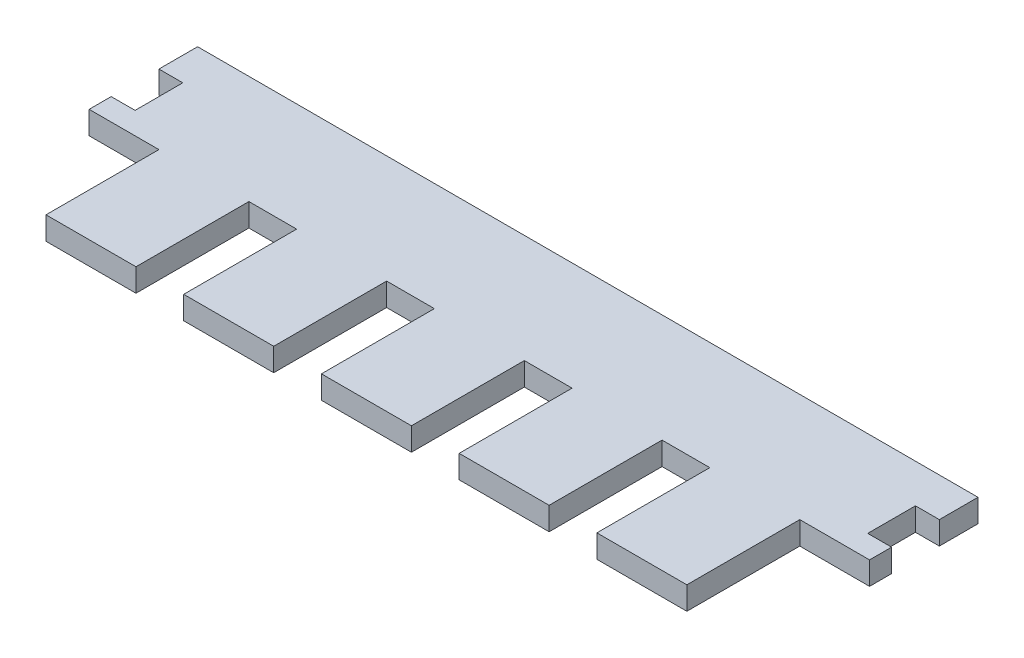
ISO-10303-21;
HEADER;
FILE_DESCRIPTION(('STEP AP214'),'2;1');
FILE_NAME('part.step','',(''),(''),'','','');
FILE_SCHEMA(('AUTOMOTIVE_DESIGN { 1 0 10303 214 1 1 1 1 }'));
ENDSEC;
DATA;
#1=APPLICATION_CONTEXT('core data for automotive mechanical design processes');
#2=APPLICATION_PROTOCOL_DEFINITION('international standard','automotive_design',2000,#1);
#3=PRODUCT_CONTEXT('',#1,'mechanical');
#4=PRODUCT('Part','Part','',(#3));
#5=PRODUCT_RELATED_PRODUCT_CATEGORY('part','',(#4));
#6=PRODUCT_DEFINITION_FORMATION('','',#4);
#7=PRODUCT_DEFINITION_CONTEXT('part definition',#1,'design');
#8=PRODUCT_DEFINITION('design','',#6,#7);
#9=PRODUCT_DEFINITION_SHAPE('','',#8);
#10=(LENGTH_UNIT() NAMED_UNIT(*) SI_UNIT(.MILLI.,.METRE.));
#11=(NAMED_UNIT(*) PLANE_ANGLE_UNIT() SI_UNIT($,.RADIAN.));
#12=(NAMED_UNIT(*) SI_UNIT($,.STERADIAN.) SOLID_ANGLE_UNIT());
#13=UNCERTAINTY_MEASURE_WITH_UNIT(LENGTH_MEASURE(1.E-05),#10,'distance_accuracy_value','');
#14=(GEOMETRIC_REPRESENTATION_CONTEXT(3) GLOBAL_UNCERTAINTY_ASSIGNED_CONTEXT((#13)) GLOBAL_UNIT_ASSIGNED_CONTEXT((#10,
#11,#12)) REPRESENTATION_CONTEXT('',''));
#15=CARTESIAN_POINT('',(0.,0.,0.));
#16=DIRECTION('',(0.,0.,1.));
#17=DIRECTION('',(1.,0.,0.));
#18=AXIS2_PLACEMENT_3D('',#15,#16,#17);
#19=CARTESIAN_POINT('',(107.95,6.35,28.575));
#20=DIRECTION('',(-1.,0.,0.));
#21=DIRECTION('',(0.,0.,1.));
#22=AXIS2_PLACEMENT_3D('',#19,#20,#21);
#23=PLANE('',#22);
#24=DIRECTION('',(0.,0.,-1.));
#25=VECTOR('',#24,1.);
#26=CARTESIAN_POINT('',(107.95,0.,28.575));
#27=LINE('',#26,#25);
#28=CARTESIAN_POINT('',(107.95,0.,9.27100000000006));
#29=VERTEX_POINT('',#28);
#30=CARTESIAN_POINT('',(107.95,0.,-1.425));
#31=VERTEX_POINT('',#30);
#32=EDGE_CURVE('E281',#29,#31,#27,.T.);
#33=ORIENTED_EDGE('',*,*,#32,.T.);
#34=DIRECTION('',(0.,1.,0.));
#35=VECTOR('',#34,1.);
#36=CARTESIAN_POINT('',(107.95,0.,-1.425));
#37=LINE('',#36,#35);
#38=CARTESIAN_POINT('',(107.95,6.35,-1.425));
#39=VERTEX_POINT('',#38);
#40=EDGE_CURVE('E47',#31,#39,#37,.T.);
#41=ORIENTED_EDGE('',*,*,#40,.T.);
#42=DIRECTION('',(0.,0.,-1.));
#43=VECTOR('',#42,1.);
#44=CARTESIAN_POINT('',(107.95,6.35,28.575));
#45=LINE('',#44,#43);
#46=CARTESIAN_POINT('',(107.95,6.35,9.27100000000006));
#47=VERTEX_POINT('',#46);
#48=EDGE_CURVE('E269',#47,#39,#45,.T.);
#49=ORIENTED_EDGE('',*,*,#48,.F.);
#50=DIRECTION('',(0.,1.,0.));
#51=VECTOR('',#50,1.);
#52=CARTESIAN_POINT('',(107.95,6.35,9.27100000000006));
#53=LINE('',#52,#51);
#54=EDGE_CURVE('E286',#29,#47,#53,.T.);
#55=ORIENTED_EDGE('',*,*,#54,.F.);
#56=EDGE_LOOP('',(#33,#41,#49,#55));
#57=FACE_BOUND('',#56,.T.);
#58=ADVANCED_FACE('F33',(#57),#23,.F.);
#59=DIRECTION('',(0.,-1.,0.));
#60=VECTOR('',#59,1.);
#61=CARTESIAN_POINT('',(107.95,6.35,22.4790000000001));
#62=LINE('',#61,#60);
#63=CARTESIAN_POINT('',(107.95,6.35,22.4790000000001));
#64=VERTEX_POINT('',#63);
#65=CARTESIAN_POINT('',(107.95,0.,22.4790000000001));
#66=VERTEX_POINT('',#65);
#67=EDGE_CURVE('E294',#64,#66,#62,.T.);
#68=ORIENTED_EDGE('',*,*,#67,.F.);
#69=CARTESIAN_POINT('',(107.95,6.35,28.575));
#70=VERTEX_POINT('',#69);
#71=EDGE_CURVE('E431',#70,#64,#45,.T.);
#72=ORIENTED_EDGE('',*,*,#71,.F.);
#73=DIRECTION('',(0.,-1.,0.));
#74=VECTOR('',#73,1.);
#75=CARTESIAN_POINT('',(107.95,6.35,28.575));
#76=LINE('',#75,#74);
#77=CARTESIAN_POINT('',(107.95,0.,28.575));
#78=VERTEX_POINT('',#77);
#79=EDGE_CURVE('E271',#70,#78,#76,.T.);
#80=ORIENTED_EDGE('',*,*,#79,.T.);
#81=EDGE_CURVE('E264',#78,#66,#27,.T.);
#82=ORIENTED_EDGE('',*,*,#81,.T.);
#83=EDGE_LOOP('',(#68,#72,#80,#82));
#84=FACE_BOUND('',#83,.T.);
#85=ADVANCED_FACE('F561',(#84),#23,.F.);
#86=CARTESIAN_POINT('',(-107.95,6.35,28.575));
#87=DIRECTION('',(1.,0.,0.));
#88=DIRECTION('',(0.,0.,-1.));
#89=AXIS2_PLACEMENT_3D('',#86,#87,#88);
#90=PLANE('',#89);
#91=DIRECTION('',(0.,1.,0.));
#92=VECTOR('',#91,1.);
#93=CARTESIAN_POINT('',(-107.95,6.35,22.4790000000001));
#94=LINE('',#93,#92);
#95=CARTESIAN_POINT('',(-107.95,0.,22.4790000000001));
#96=VERTEX_POINT('',#95);
#97=CARTESIAN_POINT('',(-107.95,6.35,22.4790000000001));
#98=VERTEX_POINT('',#97);
#99=EDGE_CURVE('E296',#96,#98,#94,.T.);
#100=ORIENTED_EDGE('',*,*,#99,.F.);
#101=DIRECTION('',(0.,0.,1.));
#102=VECTOR('',#101,1.);
#103=CARTESIAN_POINT('',(-107.95,0.,28.575));
#104=LINE('',#103,#102);
#105=CARTESIAN_POINT('',(-107.95,0.,28.575));
#106=VERTEX_POINT('',#105);
#107=EDGE_CURVE('E259',#96,#106,#104,.T.);
#108=ORIENTED_EDGE('',*,*,#107,.T.);
#109=DIRECTION('',(0.,-1.,0.));
#110=VECTOR('',#109,1.);
#111=CARTESIAN_POINT('',(-107.95,6.35,28.575));
#112=LINE('',#111,#110);
#113=CARTESIAN_POINT('',(-107.95,6.35,28.575));
#114=VERTEX_POINT('',#113);
#115=EDGE_CURVE('E274',#114,#106,#112,.T.);
#116=ORIENTED_EDGE('',*,*,#115,.F.);
#117=DIRECTION('',(0.,0.,1.));
#118=VECTOR('',#117,1.);
#119=CARTESIAN_POINT('',(-107.95,6.35,28.575));
#120=LINE('',#119,#118);
#121=EDGE_CURVE('E434',#98,#114,#120,.T.);
#122=ORIENTED_EDGE('',*,*,#121,.F.);
#123=EDGE_LOOP('',(#100,#108,#116,#122));
#124=FACE_BOUND('',#123,.T.);
#125=ADVANCED_FACE('F475',(#124),#90,.F.);
#126=CARTESIAN_POINT('',(-107.95,6.35,-1.425));
#127=VERTEX_POINT('',#126);
#128=CARTESIAN_POINT('',(-107.95,6.35,9.27100000000006));
#129=VERTEX_POINT('',#128);
#130=EDGE_CURVE('E251',#127,#129,#120,.T.);
#131=ORIENTED_EDGE('',*,*,#130,.F.);
#132=DIRECTION('',(0.,1.,0.));
#133=VECTOR('',#132,1.);
#134=CARTESIAN_POINT('',(-107.95,0.,-1.425));
#135=LINE('',#134,#133);
#136=CARTESIAN_POINT('',(-107.95,0.,-1.425));
#137=VERTEX_POINT('',#136);
#138=EDGE_CURVE('E242',#137,#127,#135,.T.);
#139=ORIENTED_EDGE('',*,*,#138,.F.);
#140=CARTESIAN_POINT('',(-107.95,0.,9.27100000000006));
#141=VERTEX_POINT('',#140);
#142=EDGE_CURVE('E55',#137,#141,#104,.T.);
#143=ORIENTED_EDGE('',*,*,#142,.T.);
#144=DIRECTION('',(0.,-1.,0.));
#145=VECTOR('',#144,1.);
#146=CARTESIAN_POINT('',(-107.95,6.35,9.27100000000006));
#147=LINE('',#146,#145);
#148=EDGE_CURVE('E293',#129,#141,#147,.T.);
#149=ORIENTED_EDGE('',*,*,#148,.F.);
#150=EDGE_LOOP('',(#131,#139,#143,#149));
#151=FACE_BOUND('',#150,.T.);
#152=ADVANCED_FACE('F250',(#151),#90,.F.);
#153=CARTESIAN_POINT('',(0.,6.35,0.));
#154=DIRECTION('',(0.,-1.,0.));
#155=DIRECTION('',(0.,0.,-1.));
#156=AXIS2_PLACEMENT_3D('',#153,#154,#155);
#157=PLANE('',#156);
#158=ORIENTED_EDGE('',*,*,#48,.T.);
#159=DIRECTION('',(1.,0.,0.));
#160=VECTOR('',#159,1.);
#161=CARTESIAN_POINT('',(-107.95,6.35,-1.425));
#162=LINE('',#161,#160);
#163=EDGE_CURVE('E247',#127,#39,#162,.T.);
#164=ORIENTED_EDGE('',*,*,#163,.F.);
#165=ORIENTED_EDGE('',*,*,#130,.T.);
#166=DIRECTION('',(-1.,0.,0.));
#167=VECTOR('',#166,1.);
#168=CARTESIAN_POINT('',(-114.554,6.35,9.27100000000006));
#169=LINE('',#168,#167);
#170=CARTESIAN_POINT('',(-101.346,6.35,9.27100000000006));
#171=VERTEX_POINT('',#170);
#172=EDGE_CURVE('E450',#171,#129,#169,.T.);
#173=ORIENTED_EDGE('',*,*,#172,.F.);
#174=DIRECTION('',(0.,0.,-1.));
#175=VECTOR('',#174,1.);
#176=CARTESIAN_POINT('',(-101.346,6.35,9.27100000000006));
#177=LINE('',#176,#175);
#178=CARTESIAN_POINT('',(-101.346,6.35,22.4790000000001));
#179=VERTEX_POINT('',#178);
#180=EDGE_CURVE('E455',#179,#171,#177,.T.);
#181=ORIENTED_EDGE('',*,*,#180,.F.);
#182=DIRECTION('',(1.,0.,0.));
#183=VECTOR('',#182,1.);
#184=CARTESIAN_POINT('',(-114.554,6.35,22.4790000000001));
#185=LINE('',#184,#183);
#186=EDGE_CURVE('E458',#98,#179,#185,.T.);
#187=ORIENTED_EDGE('',*,*,#186,.F.);
#188=ORIENTED_EDGE('',*,*,#121,.T.);
#189=DIRECTION('',(1.,0.,0.));
#190=VECTOR('',#189,1.);
#191=CARTESIAN_POINT('',(-107.95,6.35,28.575));
#192=LINE('',#191,#190);
#193=CARTESIAN_POINT('',(-88.646,6.35,28.575));
#194=VERTEX_POINT('',#193);
#195=EDGE_CURVE('E275',#114,#194,#192,.T.);
#196=ORIENTED_EDGE('',*,*,#195,.T.);
#197=DIRECTION('',(0.,0.,1.));
#198=VECTOR('',#197,1.);
#199=CARTESIAN_POINT('',(-88.646,6.35,28.575));
#200=LINE('',#199,#198);
#201=CARTESIAN_POINT('',(-88.646,6.35,59.817));
#202=VERTEX_POINT('',#201);
#203=EDGE_CURVE('E408',#194,#202,#200,.T.);
#204=ORIENTED_EDGE('',*,*,#203,.T.);
#205=DIRECTION('',(1.,0.,0.));
#206=VECTOR('',#205,1.);
#207=CARTESIAN_POINT('',(-88.646,6.35,59.817));
#208=LINE('',#207,#206);
#209=CARTESIAN_POINT('',(-63.754,6.35,59.817));
#210=VERTEX_POINT('',#209);
#211=EDGE_CURVE('E410',#202,#210,#208,.T.);
#212=ORIENTED_EDGE('',*,*,#211,.T.);
#213=DIRECTION('',(0.,0.,-1.));
#214=VECTOR('',#213,1.);
#215=CARTESIAN_POINT('',(-63.754,6.35,59.817));
#216=LINE('',#215,#214);
#217=CARTESIAN_POINT('',(-63.754,6.35,28.575));
#218=VERTEX_POINT('',#217);
#219=EDGE_CURVE('E413',#210,#218,#216,.T.);
#220=ORIENTED_EDGE('',*,*,#219,.T.);
#221=CARTESIAN_POINT('',(-50.546,6.35,28.575));
#222=VERTEX_POINT('',#221);
#223=EDGE_CURVE('E436',#218,#222,#192,.T.);
#224=ORIENTED_EDGE('',*,*,#223,.T.);
#225=DIRECTION('',(0.,0.,1.));
#226=VECTOR('',#225,1.);
#227=CARTESIAN_POINT('',(-50.546,6.35,28.575));
#228=LINE('',#227,#226);
#229=CARTESIAN_POINT('',(-50.546,6.35,59.817));
#230=VERTEX_POINT('',#229);
#231=EDGE_CURVE('E382',#222,#230,#228,.T.);
#232=ORIENTED_EDGE('',*,*,#231,.T.);
#233=DIRECTION('',(1.,0.,0.));
#234=VECTOR('',#233,1.);
#235=CARTESIAN_POINT('',(-50.546,6.35,59.817));
#236=LINE('',#235,#234);
#237=CARTESIAN_POINT('',(-25.654,6.35,59.817));
#238=VERTEX_POINT('',#237);
#239=EDGE_CURVE('E384',#230,#238,#236,.T.);
#240=ORIENTED_EDGE('',*,*,#239,.T.);
#241=DIRECTION('',(0.,0.,-1.));
#242=VECTOR('',#241,1.);
#243=CARTESIAN_POINT('',(-25.654,6.35,59.817));
#244=LINE('',#243,#242);
#245=CARTESIAN_POINT('',(-25.654,6.35,28.575));
#246=VERTEX_POINT('',#245);
#247=EDGE_CURVE('E387',#238,#246,#244,.T.);
#248=ORIENTED_EDGE('',*,*,#247,.T.);
#249=CARTESIAN_POINT('',(-12.446,6.35,28.575));
#250=VERTEX_POINT('',#249);
#251=EDGE_CURVE('E441',#246,#250,#192,.T.);
#252=ORIENTED_EDGE('',*,*,#251,.T.);
#253=DIRECTION('',(0.,0.,1.));
#254=VECTOR('',#253,1.);
#255=CARTESIAN_POINT('',(-12.446,6.35,28.575));
#256=LINE('',#255,#254);
#257=CARTESIAN_POINT('',(-12.446,6.35,59.817));
#258=VERTEX_POINT('',#257);
#259=EDGE_CURVE('E356',#250,#258,#256,.T.);
#260=ORIENTED_EDGE('',*,*,#259,.T.);
#261=DIRECTION('',(1.,0.,0.));
#262=VECTOR('',#261,1.);
#263=CARTESIAN_POINT('',(-12.446,6.35,59.817));
#264=LINE('',#263,#262);
#265=CARTESIAN_POINT('',(12.446,6.35,59.817));
#266=VERTEX_POINT('',#265);
#267=EDGE_CURVE('E358',#258,#266,#264,.T.);
#268=ORIENTED_EDGE('',*,*,#267,.T.);
#269=DIRECTION('',(0.,0.,-1.));
#270=VECTOR('',#269,1.);
#271=CARTESIAN_POINT('',(12.446,6.35,59.817));
#272=LINE('',#271,#270);
#273=CARTESIAN_POINT('',(12.446,6.35,28.575));
#274=VERTEX_POINT('',#273);
#275=EDGE_CURVE('E361',#266,#274,#272,.T.);
#276=ORIENTED_EDGE('',*,*,#275,.T.);
#277=CARTESIAN_POINT('',(25.654,6.35,28.575));
#278=VERTEX_POINT('',#277);
#279=EDGE_CURVE('E445',#274,#278,#192,.T.);
#280=ORIENTED_EDGE('',*,*,#279,.T.);
#281=DIRECTION('',(0.,0.,1.));
#282=VECTOR('',#281,1.);
#283=CARTESIAN_POINT('',(25.654,6.35,28.575));
#284=LINE('',#283,#282);
#285=CARTESIAN_POINT('',(25.654,6.35,59.817));
#286=VERTEX_POINT('',#285);
#287=EDGE_CURVE('E330',#278,#286,#284,.T.);
#288=ORIENTED_EDGE('',*,*,#287,.T.);
#289=DIRECTION('',(1.,0.,0.));
#290=VECTOR('',#289,1.);
#291=CARTESIAN_POINT('',(25.654,6.35,59.817));
#292=LINE('',#291,#290);
#293=CARTESIAN_POINT('',(50.546,6.35,59.817));
#294=VERTEX_POINT('',#293);
#295=EDGE_CURVE('E332',#286,#294,#292,.T.);
#296=ORIENTED_EDGE('',*,*,#295,.T.);
#297=DIRECTION('',(0.,0.,-1.));
#298=VECTOR('',#297,1.);
#299=CARTESIAN_POINT('',(50.546,6.35,59.817));
#300=LINE('',#299,#298);
#301=CARTESIAN_POINT('',(50.546,6.35,28.575));
#302=VERTEX_POINT('',#301);
#303=EDGE_CURVE('E335',#294,#302,#300,.T.);
#304=ORIENTED_EDGE('',*,*,#303,.T.);
#305=CARTESIAN_POINT('',(63.754,6.35,28.575));
#306=VERTEX_POINT('',#305);
#307=EDGE_CURVE('E442',#302,#306,#192,.T.);
#308=ORIENTED_EDGE('',*,*,#307,.T.);
#309=DIRECTION('',(0.,0.,1.));
#310=VECTOR('',#309,1.);
#311=CARTESIAN_POINT('',(63.754,6.35,28.575));
#312=LINE('',#311,#310);
#313=CARTESIAN_POINT('',(63.754,6.35,59.817));
#314=VERTEX_POINT('',#313);
#315=EDGE_CURVE('E304',#306,#314,#312,.T.);
#316=ORIENTED_EDGE('',*,*,#315,.T.);
#317=DIRECTION('',(1.,0.,0.));
#318=VECTOR('',#317,1.);
#319=CARTESIAN_POINT('',(63.754,6.35,59.817));
#320=LINE('',#319,#318);
#321=CARTESIAN_POINT('',(88.646,6.35,59.817));
#322=VERTEX_POINT('',#321);
#323=EDGE_CURVE('E306',#314,#322,#320,.T.);
#324=ORIENTED_EDGE('',*,*,#323,.T.);
#325=DIRECTION('',(0.,0.,-1.));
#326=VECTOR('',#325,1.);
#327=CARTESIAN_POINT('',(88.646,6.35,59.817));
#328=LINE('',#327,#326);
#329=CARTESIAN_POINT('',(88.646,6.35,28.575));
#330=VERTEX_POINT('',#329);
#331=EDGE_CURVE('E309',#322,#330,#328,.T.);
#332=ORIENTED_EDGE('',*,*,#331,.T.);
#333=EDGE_CURVE('E437',#330,#70,#192,.T.);
#334=ORIENTED_EDGE('',*,*,#333,.T.);
#335=ORIENTED_EDGE('',*,*,#71,.T.);
#336=DIRECTION('',(1.,0.,0.));
#337=VECTOR('',#336,1.);
#338=CARTESIAN_POINT('',(114.554,6.35,22.4790000000001));
#339=LINE('',#338,#337);
#340=CARTESIAN_POINT('',(101.346,6.35,22.4790000000001));
#341=VERTEX_POINT('',#340);
#342=EDGE_CURVE('E564',#341,#64,#339,.T.);
#343=ORIENTED_EDGE('',*,*,#342,.F.);
#344=DIRECTION('',(0.,0.,1.));
#345=VECTOR('',#344,1.);
#346=CARTESIAN_POINT('',(101.346,6.35,9.27100000000006));
#347=LINE('',#346,#345);
#348=CARTESIAN_POINT('',(101.346,6.35,9.27100000000006));
#349=VERTEX_POINT('',#348);
#350=EDGE_CURVE('E565',#349,#341,#347,.T.);
#351=ORIENTED_EDGE('',*,*,#350,.F.);
#352=DIRECTION('',(-1.,0.,0.));
#353=VECTOR('',#352,1.);
#354=CARTESIAN_POINT('',(114.554,6.35,9.27100000000006));
#355=LINE('',#354,#353);
#356=EDGE_CURVE('E571',#47,#349,#355,.T.);
#357=ORIENTED_EDGE('',*,*,#356,.F.);
#358=EDGE_LOOP('',(#158,#164,#165,#173,#181,#187,#188,#196,#204,#212,#220,#224,#232,#240,#248,
#252,#260,#268,#276,#280,#288,#296,#304,#308,#316,#324,#332,#334,#335,#343,#351,#357));
#359=FACE_BOUND('',#358,.T.);
#360=ADVANCED_FACE('F448',(#359),#157,.F.);
#361=CARTESIAN_POINT('',(0.,0.,0.));
#362=DIRECTION('',(0.,-1.,0.));
#363=DIRECTION('',(0.,0.,-1.));
#364=AXIS2_PLACEMENT_3D('',#361,#362,#363);
#365=PLANE('',#364);
#366=DIRECTION('',(1.,0.,0.));
#367=VECTOR('',#366,1.);
#368=CARTESIAN_POINT('',(-107.95,0.,-1.425));
#369=LINE('',#368,#367);
#370=EDGE_CURVE('E240',#137,#31,#369,.T.);
#371=ORIENTED_EDGE('',*,*,#370,.T.);
#372=ORIENTED_EDGE('',*,*,#32,.F.);
#373=DIRECTION('',(-1.,0.,0.));
#374=VECTOR('',#373,1.);
#375=CARTESIAN_POINT('',(0.,0.,9.27100000000006));
#376=LINE('',#375,#374);
#377=CARTESIAN_POINT('',(101.346,0.,9.27100000000006));
#378=VERTEX_POINT('',#377);
#379=EDGE_CURVE('E40',#29,#378,#376,.T.);
#380=ORIENTED_EDGE('',*,*,#379,.T.);
#381=DIRECTION('',(0.,0.,1.));
#382=VECTOR('',#381,1.);
#383=CARTESIAN_POINT('',(101.346,0.,9.27100000000006));
#384=LINE('',#383,#382);
#385=CARTESIAN_POINT('',(101.346,0.,22.4790000000001));
#386=VERTEX_POINT('',#385);
#387=EDGE_CURVE('E280',#378,#386,#384,.T.);
#388=ORIENTED_EDGE('',*,*,#387,.T.);
#389=DIRECTION('',(1.,0.,0.));
#390=VECTOR('',#389,1.);
#391=CARTESIAN_POINT('',(114.554,0.,22.4790000000001));
#392=LINE('',#391,#390);
#393=EDGE_CURVE('E576',#386,#66,#392,.T.);
#394=ORIENTED_EDGE('',*,*,#393,.T.);
#395=ORIENTED_EDGE('',*,*,#81,.F.);
#396=DIRECTION('',(1.,0.,0.));
#397=VECTOR('',#396,1.);
#398=CARTESIAN_POINT('',(-107.95,0.,28.575));
#399=LINE('',#398,#397);
#400=CARTESIAN_POINT('',(88.646,0.,28.575));
#401=VERTEX_POINT('',#400);
#402=EDGE_CURVE('E258',#401,#78,#399,.T.);
#403=ORIENTED_EDGE('',*,*,#402,.F.);
#404=DIRECTION('',(0.,0.,-1.));
#405=VECTOR('',#404,1.);
#406=CARTESIAN_POINT('',(88.646,0.,59.817));
#407=LINE('',#406,#405);
#408=CARTESIAN_POINT('',(88.646,0.,59.817));
#409=VERTEX_POINT('',#408);
#410=EDGE_CURVE('E307',#409,#401,#407,.T.);
#411=ORIENTED_EDGE('',*,*,#410,.F.);
#412=DIRECTION('',(1.,0.,0.));
#413=VECTOR('',#412,1.);
#414=CARTESIAN_POINT('',(63.754,0.,59.817));
#415=LINE('',#414,#413);
#416=CARTESIAN_POINT('',(63.754,0.,59.817));
#417=VERTEX_POINT('',#416);
#418=EDGE_CURVE('E314',#417,#409,#415,.T.);
#419=ORIENTED_EDGE('',*,*,#418,.F.);
#420=DIRECTION('',(0.,0.,1.));
#421=VECTOR('',#420,1.);
#422=CARTESIAN_POINT('',(63.754,0.,28.575));
#423=LINE('',#422,#421);
#424=CARTESIAN_POINT('',(63.754,0.,28.575));
#425=VERTEX_POINT('',#424);
#426=EDGE_CURVE('E303',#425,#417,#423,.T.);
#427=ORIENTED_EDGE('',*,*,#426,.F.);
#428=CARTESIAN_POINT('',(50.546,0.,28.575));
#429=VERTEX_POINT('',#428);
#430=EDGE_CURVE('E261',#429,#425,#399,.T.);
#431=ORIENTED_EDGE('',*,*,#430,.F.);
#432=DIRECTION('',(0.,0.,-1.));
#433=VECTOR('',#432,1.);
#434=CARTESIAN_POINT('',(50.546,0.,59.817));
#435=LINE('',#434,#433);
#436=CARTESIAN_POINT('',(50.546,0.,59.817));
#437=VERTEX_POINT('',#436);
#438=EDGE_CURVE('E333',#437,#429,#435,.T.);
#439=ORIENTED_EDGE('',*,*,#438,.F.);
#440=DIRECTION('',(1.,0.,0.));
#441=VECTOR('',#440,1.);
#442=CARTESIAN_POINT('',(25.654,0.,59.817));
#443=LINE('',#442,#441);
#444=CARTESIAN_POINT('',(25.654,0.,59.817));
#445=VERTEX_POINT('',#444);
#446=EDGE_CURVE('E340',#445,#437,#443,.T.);
#447=ORIENTED_EDGE('',*,*,#446,.F.);
#448=DIRECTION('',(0.,0.,1.));
#449=VECTOR('',#448,1.);
#450=CARTESIAN_POINT('',(25.654,0.,28.575));
#451=LINE('',#450,#449);
#452=CARTESIAN_POINT('',(25.654,0.,28.575));
#453=VERTEX_POINT('',#452);
#454=EDGE_CURVE('E329',#453,#445,#451,.T.);
#455=ORIENTED_EDGE('',*,*,#454,.F.);
#456=CARTESIAN_POINT('',(12.446,0.,28.575));
#457=VERTEX_POINT('',#456);
#458=EDGE_CURVE('E859',#457,#453,#399,.T.);
#459=ORIENTED_EDGE('',*,*,#458,.F.);
#460=DIRECTION('',(0.,0.,-1.));
#461=VECTOR('',#460,1.);
#462=CARTESIAN_POINT('',(12.446,0.,59.817));
#463=LINE('',#462,#461);
#464=CARTESIAN_POINT('',(12.446,0.,59.817));
#465=VERTEX_POINT('',#464);
#466=EDGE_CURVE('E359',#465,#457,#463,.T.);
#467=ORIENTED_EDGE('',*,*,#466,.F.);
#468=DIRECTION('',(1.,0.,0.));
#469=VECTOR('',#468,1.);
#470=CARTESIAN_POINT('',(-12.446,0.,59.817));
#471=LINE('',#470,#469);
#472=CARTESIAN_POINT('',(-12.446,0.,59.817));
#473=VERTEX_POINT('',#472);
#474=EDGE_CURVE('E366',#473,#465,#471,.T.);
#475=ORIENTED_EDGE('',*,*,#474,.F.);
#476=DIRECTION('',(0.,0.,1.));
#477=VECTOR('',#476,1.);
#478=CARTESIAN_POINT('',(-12.446,0.,28.575));
#479=LINE('',#478,#477);
#480=CARTESIAN_POINT('',(-12.446,0.,28.575));
#481=VERTEX_POINT('',#480);
#482=EDGE_CURVE('E355',#481,#473,#479,.T.);
#483=ORIENTED_EDGE('',*,*,#482,.F.);
#484=CARTESIAN_POINT('',(-25.654,0.,28.575));
#485=VERTEX_POINT('',#484);
#486=EDGE_CURVE('E516',#485,#481,#399,.T.);
#487=ORIENTED_EDGE('',*,*,#486,.F.);
#488=DIRECTION('',(0.,0.,-1.));
#489=VECTOR('',#488,1.);
#490=CARTESIAN_POINT('',(-25.654,0.,59.817));
#491=LINE('',#490,#489);
#492=CARTESIAN_POINT('',(-25.654,0.,59.817));
#493=VERTEX_POINT('',#492);
#494=EDGE_CURVE('E385',#493,#485,#491,.T.);
#495=ORIENTED_EDGE('',*,*,#494,.F.);
#496=DIRECTION('',(1.,0.,0.));
#497=VECTOR('',#496,1.);
#498=CARTESIAN_POINT('',(-50.546,0.,59.817));
#499=LINE('',#498,#497);
#500=CARTESIAN_POINT('',(-50.546,0.,59.817));
#501=VERTEX_POINT('',#500);
#502=EDGE_CURVE('E392',#501,#493,#499,.T.);
#503=ORIENTED_EDGE('',*,*,#502,.F.);
#504=DIRECTION('',(0.,0.,1.));
#505=VECTOR('',#504,1.);
#506=CARTESIAN_POINT('',(-50.546,0.,28.575));
#507=LINE('',#506,#505);
#508=CARTESIAN_POINT('',(-50.546,0.,28.575));
#509=VERTEX_POINT('',#508);
#510=EDGE_CURVE('E381',#509,#501,#507,.T.);
#511=ORIENTED_EDGE('',*,*,#510,.F.);
#512=CARTESIAN_POINT('',(-63.754,0.,28.575));
#513=VERTEX_POINT('',#512);
#514=EDGE_CURVE('E270',#513,#509,#399,.T.);
#515=ORIENTED_EDGE('',*,*,#514,.F.);
#516=DIRECTION('',(0.,0.,-1.));
#517=VECTOR('',#516,1.);
#518=CARTESIAN_POINT('',(-63.754,0.,59.817));
#519=LINE('',#518,#517);
#520=CARTESIAN_POINT('',(-63.754,0.,59.817));
#521=VERTEX_POINT('',#520);
#522=EDGE_CURVE('E411',#521,#513,#519,.T.);
#523=ORIENTED_EDGE('',*,*,#522,.F.);
#524=DIRECTION('',(1.,0.,0.));
#525=VECTOR('',#524,1.);
#526=CARTESIAN_POINT('',(-88.646,0.,59.817));
#527=LINE('',#526,#525);
#528=CARTESIAN_POINT('',(-88.646,0.,59.817));
#529=VERTEX_POINT('',#528);
#530=EDGE_CURVE('E417',#529,#521,#527,.T.);
#531=ORIENTED_EDGE('',*,*,#530,.F.);
#532=DIRECTION('',(0.,0.,1.));
#533=VECTOR('',#532,1.);
#534=CARTESIAN_POINT('',(-88.646,0.,28.575));
#535=LINE('',#534,#533);
#536=CARTESIAN_POINT('',(-88.646,0.,28.575));
#537=VERTEX_POINT('',#536);
#538=EDGE_CURVE('E407',#537,#529,#535,.T.);
#539=ORIENTED_EDGE('',*,*,#538,.F.);
#540=EDGE_CURVE('E263',#106,#537,#399,.T.);
#541=ORIENTED_EDGE('',*,*,#540,.F.);
#542=ORIENTED_EDGE('',*,*,#107,.F.);
#543=DIRECTION('',(1.,0.,0.));
#544=VECTOR('',#543,1.);
#545=CARTESIAN_POINT('',(0.,0.,22.4790000000001));
#546=LINE('',#545,#544);
#547=CARTESIAN_POINT('',(-101.346,0.,22.4790000000001));
#548=VERTEX_POINT('',#547);
#549=EDGE_CURVE('E11',#96,#548,#546,.T.);
#550=ORIENTED_EDGE('',*,*,#549,.T.);
#551=DIRECTION('',(0.,0.,-1.));
#552=VECTOR('',#551,1.);
#553=CARTESIAN_POINT('',(-101.346,0.,9.27100000000006));
#554=LINE('',#553,#552);
#555=CARTESIAN_POINT('',(-101.346,0.,9.27100000000006));
#556=VERTEX_POINT('',#555);
#557=EDGE_CURVE('E462',#548,#556,#554,.T.);
#558=ORIENTED_EDGE('',*,*,#557,.T.);
#559=DIRECTION('',(-1.,0.,0.));
#560=VECTOR('',#559,1.);
#561=CARTESIAN_POINT('',(-114.554,0.,9.27100000000006));
#562=LINE('',#561,#560);
#563=EDGE_CURVE('E257',#556,#141,#562,.T.);
#564=ORIENTED_EDGE('',*,*,#563,.T.);
#565=ORIENTED_EDGE('',*,*,#142,.F.);
#566=EDGE_LOOP('',(#371,#372,#380,#388,#394,#395,#403,#411,#419,#427,#431,#439,#447,#455,#459,
#467,#475,#483,#487,#495,#503,#511,#515,#523,#531,#539,#541,#542,#550,#558,#564,#565));
#567=FACE_BOUND('',#566,.T.);
#568=ADVANCED_FACE('F254',(#567),#365,.T.);
#569=CARTESIAN_POINT('',(-107.95,6.35,28.575));
#570=DIRECTION('',(0.,0.,-1.));
#571=DIRECTION('',(-1.,0.,0.));
#572=AXIS2_PLACEMENT_3D('',#569,#570,#571);
#573=PLANE('',#572);
#574=DIRECTION('',(0.,-1.,0.));
#575=VECTOR('',#574,1.);
#576=CARTESIAN_POINT('',(63.754,6.35,28.575));
#577=LINE('',#576,#575);
#578=EDGE_CURVE('E326',#306,#425,#577,.T.);
#579=ORIENTED_EDGE('',*,*,#578,.F.);
#580=ORIENTED_EDGE('',*,*,#307,.F.);
#581=DIRECTION('',(0.,-1.,0.));
#582=VECTOR('',#581,1.);
#583=CARTESIAN_POINT('',(50.546,6.35,28.575));
#584=LINE('',#583,#582);
#585=EDGE_CURVE('E338',#302,#429,#584,.T.);
#586=ORIENTED_EDGE('',*,*,#585,.T.);
#587=ORIENTED_EDGE('',*,*,#430,.T.);
#588=EDGE_LOOP('',(#579,#580,#586,#587));
#589=FACE_BOUND('',#588,.T.);
#590=ADVANCED_FACE('F539',(#589),#573,.F.);
#591=DIRECTION('',(0.,-1.,0.));
#592=VECTOR('',#591,1.);
#593=CARTESIAN_POINT('',(88.646,6.35,28.575));
#594=LINE('',#593,#592);
#595=EDGE_CURVE('E312',#330,#401,#594,.T.);
#596=ORIENTED_EDGE('',*,*,#595,.T.);
#597=ORIENTED_EDGE('',*,*,#402,.T.);
#598=ORIENTED_EDGE('',*,*,#79,.F.);
#599=ORIENTED_EDGE('',*,*,#333,.F.);
#600=EDGE_LOOP('',(#596,#597,#598,#599));
#601=FACE_BOUND('',#600,.T.);
#602=ADVANCED_FACE('F555',(#601),#573,.F.);
#603=DIRECTION('',(0.,-1.,0.));
#604=VECTOR('',#603,1.);
#605=CARTESIAN_POINT('',(25.654,6.35,28.575));
#606=LINE('',#605,#604);
#607=EDGE_CURVE('E352',#278,#453,#606,.T.);
#608=ORIENTED_EDGE('',*,*,#607,.F.);
#609=ORIENTED_EDGE('',*,*,#279,.F.);
#610=DIRECTION('',(0.,-1.,0.));
#611=VECTOR('',#610,1.);
#612=CARTESIAN_POINT('',(12.446,6.35,28.575));
#613=LINE('',#612,#611);
#614=EDGE_CURVE('E364',#274,#457,#613,.T.);
#615=ORIENTED_EDGE('',*,*,#614,.T.);
#616=ORIENTED_EDGE('',*,*,#458,.T.);
#617=EDGE_LOOP('',(#608,#609,#615,#616));
#618=FACE_BOUND('',#617,.T.);
#619=ADVANCED_FACE('F837',(#618),#573,.F.);
#620=DIRECTION('',(0.,-1.,0.));
#621=VECTOR('',#620,1.);
#622=CARTESIAN_POINT('',(-12.446,6.35,28.575));
#623=LINE('',#622,#621);
#624=EDGE_CURVE('E378',#250,#481,#623,.T.);
#625=ORIENTED_EDGE('',*,*,#624,.F.);
#626=ORIENTED_EDGE('',*,*,#251,.F.);
#627=DIRECTION('',(0.,-1.,0.));
#628=VECTOR('',#627,1.);
#629=CARTESIAN_POINT('',(-25.654,6.35,28.575));
#630=LINE('',#629,#628);
#631=EDGE_CURVE('E390',#246,#485,#630,.T.);
#632=ORIENTED_EDGE('',*,*,#631,.T.);
#633=ORIENTED_EDGE('',*,*,#486,.T.);
#634=EDGE_LOOP('',(#625,#626,#632,#633));
#635=FACE_BOUND('',#634,.T.);
#636=ADVANCED_FACE('F515',(#635),#573,.F.);
#637=DIRECTION('',(0.,-1.,0.));
#638=VECTOR('',#637,1.);
#639=CARTESIAN_POINT('',(-50.546,6.35,28.575));
#640=LINE('',#639,#638);
#641=EDGE_CURVE('E404',#222,#509,#640,.T.);
#642=ORIENTED_EDGE('',*,*,#641,.F.);
#643=ORIENTED_EDGE('',*,*,#223,.F.);
#644=DIRECTION('',(0.,-1.,0.));
#645=VECTOR('',#644,1.);
#646=CARTESIAN_POINT('',(-63.754,6.35,28.575));
#647=LINE('',#646,#645);
#648=EDGE_CURVE('E415',#218,#513,#647,.T.);
#649=ORIENTED_EDGE('',*,*,#648,.T.);
#650=ORIENTED_EDGE('',*,*,#514,.T.);
#651=EDGE_LOOP('',(#642,#643,#649,#650));
#652=FACE_BOUND('',#651,.T.);
#653=ADVANCED_FACE('F496',(#652),#573,.F.);
#654=DIRECTION('',(0.,-1.,0.));
#655=VECTOR('',#654,1.);
#656=CARTESIAN_POINT('',(-88.646,6.35,28.575));
#657=LINE('',#656,#655);
#658=EDGE_CURVE('E428',#194,#537,#657,.T.);
#659=ORIENTED_EDGE('',*,*,#658,.F.);
#660=ORIENTED_EDGE('',*,*,#195,.F.);
#661=ORIENTED_EDGE('',*,*,#115,.T.);
#662=ORIENTED_EDGE('',*,*,#540,.T.);
#663=EDGE_LOOP('',(#659,#660,#661,#662));
#664=FACE_BOUND('',#663,.T.);
#665=ADVANCED_FACE('F479',(#664),#573,.F.);
#666=CARTESIAN_POINT('',(-88.646,6.35,28.575));
#667=DIRECTION('',(1.,0.,0.));
#668=DIRECTION('',(0.,0.,-1.));
#669=AXIS2_PLACEMENT_3D('',#666,#667,#668);
#670=PLANE('',#669);
#671=ORIENTED_EDGE('',*,*,#538,.T.);
#672=DIRECTION('',(0.,-1.,0.));
#673=VECTOR('',#672,1.);
#674=CARTESIAN_POINT('',(-88.646,6.35,59.817));
#675=LINE('',#674,#673);
#676=EDGE_CURVE('E425',#202,#529,#675,.T.);
#677=ORIENTED_EDGE('',*,*,#676,.F.);
#678=ORIENTED_EDGE('',*,*,#203,.F.);
#679=ORIENTED_EDGE('',*,*,#658,.T.);
#680=EDGE_LOOP('',(#671,#677,#678,#679));
#681=FACE_BOUND('',#680,.T.);
#682=ADVANCED_FACE('F481',(#681),#670,.F.);
#683=CARTESIAN_POINT('',(-88.646,6.35,59.817));
#684=DIRECTION('',(0.,0.,-1.));
#685=DIRECTION('',(-1.,0.,0.));
#686=AXIS2_PLACEMENT_3D('',#683,#684,#685);
#687=PLANE('',#686);
#688=ORIENTED_EDGE('',*,*,#530,.T.);
#689=DIRECTION('',(0.,-1.,0.));
#690=VECTOR('',#689,1.);
#691=CARTESIAN_POINT('',(-63.754,6.35,59.817));
#692=LINE('',#691,#690);
#693=EDGE_CURVE('E422',#210,#521,#692,.T.);
#694=ORIENTED_EDGE('',*,*,#693,.F.);
#695=ORIENTED_EDGE('',*,*,#211,.F.);
#696=ORIENTED_EDGE('',*,*,#676,.T.);
#697=EDGE_LOOP('',(#688,#694,#695,#696));
#698=FACE_BOUND('',#697,.T.);
#699=ADVANCED_FACE('F488',(#698),#687,.F.);
#700=CARTESIAN_POINT('',(-63.754,6.35,59.817));
#701=DIRECTION('',(-1.,0.,0.));
#702=DIRECTION('',(0.,0.,1.));
#703=AXIS2_PLACEMENT_3D('',#700,#701,#702);
#704=PLANE('',#703);
#705=ORIENTED_EDGE('',*,*,#522,.T.);
#706=ORIENTED_EDGE('',*,*,#648,.F.);
#707=ORIENTED_EDGE('',*,*,#219,.F.);
#708=ORIENTED_EDGE('',*,*,#693,.T.);
#709=EDGE_LOOP('',(#705,#706,#707,#708));
#710=FACE_BOUND('',#709,.T.);
#711=ADVANCED_FACE('F492',(#710),#704,.F.);
#712=CARTESIAN_POINT('',(-50.546,6.35,28.575));
#713=DIRECTION('',(1.,0.,0.));
#714=DIRECTION('',(0.,0.,-1.));
#715=AXIS2_PLACEMENT_3D('',#712,#713,#714);
#716=PLANE('',#715);
#717=ORIENTED_EDGE('',*,*,#510,.T.);
#718=DIRECTION('',(0.,-1.,0.));
#719=VECTOR('',#718,1.);
#720=CARTESIAN_POINT('',(-50.546,6.35,59.817));
#721=LINE('',#720,#719);
#722=EDGE_CURVE('E401',#230,#501,#721,.T.);
#723=ORIENTED_EDGE('',*,*,#722,.F.);
#724=ORIENTED_EDGE('',*,*,#231,.F.);
#725=ORIENTED_EDGE('',*,*,#641,.T.);
#726=EDGE_LOOP('',(#717,#723,#724,#725));
#727=FACE_BOUND('',#726,.T.);
#728=ADVANCED_FACE('F500',(#727),#716,.F.);
#729=CARTESIAN_POINT('',(-50.546,6.35,59.817));
#730=DIRECTION('',(0.,0.,-1.));
#731=DIRECTION('',(-1.,0.,0.));
#732=AXIS2_PLACEMENT_3D('',#729,#730,#731);
#733=PLANE('',#732);
#734=ORIENTED_EDGE('',*,*,#502,.T.);
#735=DIRECTION('',(0.,-1.,0.));
#736=VECTOR('',#735,1.);
#737=CARTESIAN_POINT('',(-25.654,6.35,59.817));
#738=LINE('',#737,#736);
#739=EDGE_CURVE('E398',#238,#493,#738,.T.);
#740=ORIENTED_EDGE('',*,*,#739,.F.);
#741=ORIENTED_EDGE('',*,*,#239,.F.);
#742=ORIENTED_EDGE('',*,*,#722,.T.);
#743=EDGE_LOOP('',(#734,#740,#741,#742));
#744=FACE_BOUND('',#743,.T.);
#745=ADVANCED_FACE('F506',(#744),#733,.F.);
#746=CARTESIAN_POINT('',(-25.654,6.35,59.817));
#747=DIRECTION('',(-1.,0.,0.));
#748=DIRECTION('',(0.,0.,1.));
#749=AXIS2_PLACEMENT_3D('',#746,#747,#748);
#750=PLANE('',#749);
#751=ORIENTED_EDGE('',*,*,#494,.T.);
#752=ORIENTED_EDGE('',*,*,#631,.F.);
#753=ORIENTED_EDGE('',*,*,#247,.F.);
#754=ORIENTED_EDGE('',*,*,#739,.T.);
#755=EDGE_LOOP('',(#751,#752,#753,#754));
#756=FACE_BOUND('',#755,.T.);
#757=ADVANCED_FACE('F512',(#756),#750,.F.);
#758=CARTESIAN_POINT('',(-12.446,6.35,28.575));
#759=DIRECTION('',(1.,0.,0.));
#760=DIRECTION('',(0.,0.,-1.));
#761=AXIS2_PLACEMENT_3D('',#758,#759,#760);
#762=PLANE('',#761);
#763=ORIENTED_EDGE('',*,*,#482,.T.);
#764=DIRECTION('',(0.,-1.,0.));
#765=VECTOR('',#764,1.);
#766=CARTESIAN_POINT('',(-12.446,6.35,59.817));
#767=LINE('',#766,#765);
#768=EDGE_CURVE('E375',#258,#473,#767,.T.);
#769=ORIENTED_EDGE('',*,*,#768,.F.);
#770=ORIENTED_EDGE('',*,*,#259,.F.);
#771=ORIENTED_EDGE('',*,*,#624,.T.);
#772=EDGE_LOOP('',(#763,#769,#770,#771));
#773=FACE_BOUND('',#772,.T.);
#774=ADVANCED_FACE('F622',(#773),#762,.F.);
#775=CARTESIAN_POINT('',(-12.446,6.35,59.817));
#776=DIRECTION('',(0.,0.,-1.));
#777=DIRECTION('',(-1.,0.,0.));
#778=AXIS2_PLACEMENT_3D('',#775,#776,#777);
#779=PLANE('',#778);
#780=ORIENTED_EDGE('',*,*,#474,.T.);
#781=DIRECTION('',(0.,-1.,0.));
#782=VECTOR('',#781,1.);
#783=CARTESIAN_POINT('',(12.446,6.35,59.817));
#784=LINE('',#783,#782);
#785=EDGE_CURVE('E372',#266,#465,#784,.T.);
#786=ORIENTED_EDGE('',*,*,#785,.F.);
#787=ORIENTED_EDGE('',*,*,#267,.F.);
#788=ORIENTED_EDGE('',*,*,#768,.T.);
#789=EDGE_LOOP('',(#780,#786,#787,#788));
#790=FACE_BOUND('',#789,.T.);
#791=ADVANCED_FACE('F625',(#790),#779,.F.);
#792=CARTESIAN_POINT('',(12.446,6.35,59.817));
#793=DIRECTION('',(-1.,0.,0.));
#794=DIRECTION('',(0.,0.,1.));
#795=AXIS2_PLACEMENT_3D('',#792,#793,#794);
#796=PLANE('',#795);
#797=ORIENTED_EDGE('',*,*,#466,.T.);
#798=ORIENTED_EDGE('',*,*,#614,.F.);
#799=ORIENTED_EDGE('',*,*,#275,.F.);
#800=ORIENTED_EDGE('',*,*,#785,.T.);
#801=EDGE_LOOP('',(#797,#798,#799,#800));
#802=FACE_BOUND('',#801,.T.);
#803=ADVANCED_FACE('F629',(#802),#796,.F.);
#804=CARTESIAN_POINT('',(25.654,6.35,28.575));
#805=DIRECTION('',(1.,0.,0.));
#806=DIRECTION('',(0.,0.,-1.));
#807=AXIS2_PLACEMENT_3D('',#804,#805,#806);
#808=PLANE('',#807);
#809=ORIENTED_EDGE('',*,*,#454,.T.);
#810=DIRECTION('',(0.,-1.,0.));
#811=VECTOR('',#810,1.);
#812=CARTESIAN_POINT('',(25.654,6.35,59.817));
#813=LINE('',#812,#811);
#814=EDGE_CURVE('E349',#286,#445,#813,.T.);
#815=ORIENTED_EDGE('',*,*,#814,.F.);
#816=ORIENTED_EDGE('',*,*,#287,.F.);
#817=ORIENTED_EDGE('',*,*,#607,.T.);
#818=EDGE_LOOP('',(#809,#815,#816,#817));
#819=FACE_BOUND('',#818,.T.);
#820=ADVANCED_FACE('F525',(#819),#808,.F.);
#821=CARTESIAN_POINT('',(25.654,6.35,59.817));
#822=DIRECTION('',(0.,0.,-1.));
#823=DIRECTION('',(-1.,0.,0.));
#824=AXIS2_PLACEMENT_3D('',#821,#822,#823);
#825=PLANE('',#824);
#826=ORIENTED_EDGE('',*,*,#446,.T.);
#827=DIRECTION('',(0.,-1.,0.));
#828=VECTOR('',#827,1.);
#829=CARTESIAN_POINT('',(50.546,6.35,59.817));
#830=LINE('',#829,#828);
#831=EDGE_CURVE('E346',#294,#437,#830,.T.);
#832=ORIENTED_EDGE('',*,*,#831,.F.);
#833=ORIENTED_EDGE('',*,*,#295,.F.);
#834=ORIENTED_EDGE('',*,*,#814,.T.);
#835=EDGE_LOOP('',(#826,#832,#833,#834));
#836=FACE_BOUND('',#835,.T.);
#837=ADVANCED_FACE('F531',(#836),#825,.F.);
#838=CARTESIAN_POINT('',(50.546,6.35,59.817));
#839=DIRECTION('',(-1.,0.,0.));
#840=DIRECTION('',(0.,0.,1.));
#841=AXIS2_PLACEMENT_3D('',#838,#839,#840);
#842=PLANE('',#841);
#843=ORIENTED_EDGE('',*,*,#438,.T.);
#844=ORIENTED_EDGE('',*,*,#585,.F.);
#845=ORIENTED_EDGE('',*,*,#303,.F.);
#846=ORIENTED_EDGE('',*,*,#831,.T.);
#847=EDGE_LOOP('',(#843,#844,#845,#846));
#848=FACE_BOUND('',#847,.T.);
#849=ADVANCED_FACE('F536',(#848),#842,.F.);
#850=CARTESIAN_POINT('',(63.754,6.35,28.575));
#851=DIRECTION('',(1.,0.,0.));
#852=DIRECTION('',(0.,0.,-1.));
#853=AXIS2_PLACEMENT_3D('',#850,#851,#852);
#854=PLANE('',#853);
#855=ORIENTED_EDGE('',*,*,#426,.T.);
#856=DIRECTION('',(0.,-1.,0.));
#857=VECTOR('',#856,1.);
#858=CARTESIAN_POINT('',(63.754,6.35,59.817));
#859=LINE('',#858,#857);
#860=EDGE_CURVE('E323',#314,#417,#859,.T.);
#861=ORIENTED_EDGE('',*,*,#860,.F.);
#862=ORIENTED_EDGE('',*,*,#315,.F.);
#863=ORIENTED_EDGE('',*,*,#578,.T.);
#864=EDGE_LOOP('',(#855,#861,#862,#863));
#865=FACE_BOUND('',#864,.T.);
#866=ADVANCED_FACE('F542',(#865),#854,.F.);
#867=CARTESIAN_POINT('',(63.754,6.35,59.817));
#868=DIRECTION('',(0.,0.,-1.));
#869=DIRECTION('',(-1.,0.,0.));
#870=AXIS2_PLACEMENT_3D('',#867,#868,#869);
#871=PLANE('',#870);
#872=ORIENTED_EDGE('',*,*,#418,.T.);
#873=DIRECTION('',(0.,-1.,0.));
#874=VECTOR('',#873,1.);
#875=CARTESIAN_POINT('',(88.646,6.35,59.817));
#876=LINE('',#875,#874);
#877=EDGE_CURVE('E320',#322,#409,#876,.T.);
#878=ORIENTED_EDGE('',*,*,#877,.F.);
#879=ORIENTED_EDGE('',*,*,#323,.F.);
#880=ORIENTED_EDGE('',*,*,#860,.T.);
#881=EDGE_LOOP('',(#872,#878,#879,#880));
#882=FACE_BOUND('',#881,.T.);
#883=ADVANCED_FACE('F549',(#882),#871,.F.);
#884=CARTESIAN_POINT('',(88.646,6.35,59.817));
#885=DIRECTION('',(-1.,0.,0.));
#886=DIRECTION('',(0.,0.,1.));
#887=AXIS2_PLACEMENT_3D('',#884,#885,#886);
#888=PLANE('',#887);
#889=ORIENTED_EDGE('',*,*,#410,.T.);
#890=ORIENTED_EDGE('',*,*,#595,.F.);
#891=ORIENTED_EDGE('',*,*,#331,.F.);
#892=ORIENTED_EDGE('',*,*,#877,.T.);
#893=EDGE_LOOP('',(#889,#890,#891,#892));
#894=FACE_BOUND('',#893,.T.);
#895=ADVANCED_FACE('F553',(#894),#888,.F.);
#896=CARTESIAN_POINT('',(114.554,6.35,9.27100000000006));
#897=DIRECTION('',(0.,0.,1.));
#898=DIRECTION('',(1.,0.,0.));
#899=AXIS2_PLACEMENT_3D('',#896,#897,#898);
#900=PLANE('',#899);
#901=ORIENTED_EDGE('',*,*,#54,.T.);
#902=ORIENTED_EDGE('',*,*,#356,.T.);
#903=DIRECTION('',(0.,-1.,0.));
#904=VECTOR('',#903,1.);
#905=CARTESIAN_POINT('',(101.346,6.35,9.27100000000006));
#906=LINE('',#905,#904);
#907=EDGE_CURVE('E289',#349,#378,#906,.T.);
#908=ORIENTED_EDGE('',*,*,#907,.T.);
#909=ORIENTED_EDGE('',*,*,#379,.F.);
#910=EDGE_LOOP('',(#901,#902,#908,#909));
#911=FACE_BOUND('',#910,.T.);
#912=ADVANCED_FACE('F285',(#911),#900,.T.);
#913=CARTESIAN_POINT('',(114.554,6.35,22.4790000000001));
#914=DIRECTION('',(0.,0.,-1.));
#915=DIRECTION('',(-1.,0.,0.));
#916=AXIS2_PLACEMENT_3D('',#913,#914,#915);
#917=PLANE('',#916);
#918=ORIENTED_EDGE('',*,*,#67,.T.);
#919=ORIENTED_EDGE('',*,*,#393,.F.);
#920=DIRECTION('',(0.,-1.,0.));
#921=VECTOR('',#920,1.);
#922=CARTESIAN_POINT('',(101.346,6.35,22.4790000000001));
#923=LINE('',#922,#921);
#924=EDGE_CURVE('E568',#341,#386,#923,.T.);
#925=ORIENTED_EDGE('',*,*,#924,.F.);
#926=ORIENTED_EDGE('',*,*,#342,.T.);
#927=EDGE_LOOP('',(#918,#919,#925,#926));
#928=FACE_BOUND('',#927,.T.);
#929=ADVANCED_FACE('F583',(#928),#917,.T.);
#930=CARTESIAN_POINT('',(101.346,6.35,9.27100000000006));
#931=DIRECTION('',(1.,0.,0.));
#932=DIRECTION('',(0.,0.,-1.));
#933=AXIS2_PLACEMENT_3D('',#930,#931,#932);
#934=PLANE('',#933);
#935=ORIENTED_EDGE('',*,*,#387,.F.);
#936=ORIENTED_EDGE('',*,*,#907,.F.);
#937=ORIENTED_EDGE('',*,*,#350,.T.);
#938=ORIENTED_EDGE('',*,*,#924,.T.);
#939=EDGE_LOOP('',(#935,#936,#937,#938));
#940=FACE_BOUND('',#939,.T.);
#941=ADVANCED_FACE('F582',(#940),#934,.T.);
#942=CARTESIAN_POINT('',(-114.554,6.35,22.4790000000001));
#943=DIRECTION('',(0.,0.,-1.));
#944=DIRECTION('',(-1.,0.,0.));
#945=AXIS2_PLACEMENT_3D('',#942,#943,#944);
#946=PLANE('',#945);
#947=ORIENTED_EDGE('',*,*,#99,.T.);
#948=ORIENTED_EDGE('',*,*,#186,.T.);
#949=DIRECTION('',(0.,-1.,0.));
#950=VECTOR('',#949,1.);
#951=CARTESIAN_POINT('',(-101.346,6.35,22.4790000000001));
#952=LINE('',#951,#950);
#953=EDGE_CURVE('E298',#179,#548,#952,.T.);
#954=ORIENTED_EDGE('',*,*,#953,.T.);
#955=ORIENTED_EDGE('',*,*,#549,.F.);
#956=EDGE_LOOP('',(#947,#948,#954,#955));
#957=FACE_BOUND('',#956,.T.);
#958=ADVANCED_FACE('F467',(#957),#946,.T.);
#959=CARTESIAN_POINT('',(-114.554,6.35,9.27100000000006));
#960=DIRECTION('',(0.,0.,1.));
#961=DIRECTION('',(1.,0.,0.));
#962=AXIS2_PLACEMENT_3D('',#959,#960,#961);
#963=PLANE('',#962);
#964=ORIENTED_EDGE('',*,*,#148,.T.);
#965=ORIENTED_EDGE('',*,*,#563,.F.);
#966=DIRECTION('',(0.,-1.,0.));
#967=VECTOR('',#966,1.);
#968=CARTESIAN_POINT('',(-101.346,6.35,9.27100000000006));
#969=LINE('',#968,#967);
#970=EDGE_CURVE('E454',#171,#556,#969,.T.);
#971=ORIENTED_EDGE('',*,*,#970,.F.);
#972=ORIENTED_EDGE('',*,*,#172,.T.);
#973=EDGE_LOOP('',(#964,#965,#971,#972));
#974=FACE_BOUND('',#973,.T.);
#975=ADVANCED_FACE('F453',(#974),#963,.T.);
#976=CARTESIAN_POINT('',(-101.346,6.35,9.27100000000006));
#977=DIRECTION('',(-1.,0.,0.));
#978=DIRECTION('',(0.,0.,1.));
#979=AXIS2_PLACEMENT_3D('',#976,#977,#978);
#980=PLANE('',#979);
#981=ORIENTED_EDGE('',*,*,#557,.F.);
#982=ORIENTED_EDGE('',*,*,#953,.F.);
#983=ORIENTED_EDGE('',*,*,#180,.T.);
#984=ORIENTED_EDGE('',*,*,#970,.T.);
#985=EDGE_LOOP('',(#981,#982,#983,#984));
#986=FACE_BOUND('',#985,.T.);
#987=ADVANCED_FACE('F648',(#986),#980,.T.);
#988=CARTESIAN_POINT('',(-107.95,0.,-1.425));
#989=DIRECTION('',(0.,0.,1.));
#990=DIRECTION('',(1.,0.,0.));
#991=AXIS2_PLACEMENT_3D('',#988,#989,#990);
#992=PLANE('',#991);
#993=ORIENTED_EDGE('',*,*,#163,.T.);
#994=ORIENTED_EDGE('',*,*,#40,.F.);
#995=ORIENTED_EDGE('',*,*,#370,.F.);
#996=ORIENTED_EDGE('',*,*,#138,.T.);
#997=EDGE_LOOP('',(#993,#994,#995,#996));
#998=FACE_BOUND('',#997,.T.);
#999=ADVANCED_FACE('F241',(#998),#992,.F.);
#1000=CLOSED_SHELL('',(#58,#85,#125,#152,#360,#568,#590,#602,#619,#636,#653,#665,#682,#699,#711,
#728,#745,#757,#774,#791,#803,#820,#837,#849,#866,#883,#895,#912,#929,#941,#958,#975,#987,#999));
#1001=MANIFOLD_SOLID_BREP('B2',#1000);
#1002=ADVANCED_BREP_SHAPE_REPRESENTATION('',(#18,#1001),#14);
#1003=SHAPE_DEFINITION_REPRESENTATION(#9,#1002);
ENDSEC;
END-ISO-10303-21;
